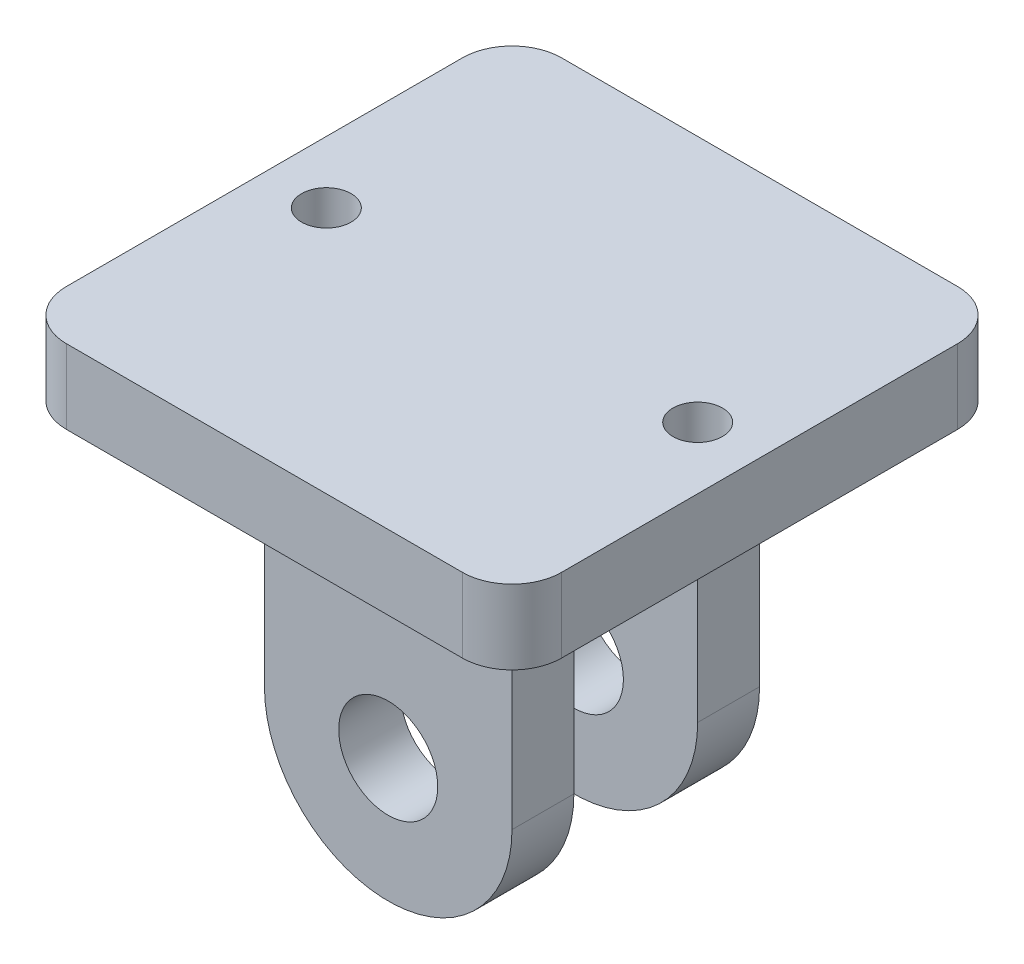
ISO-10303-21;
HEADER;
FILE_DESCRIPTION(('STEP AP214'),'2;1');
FILE_NAME('part.step','',(''),(''),'','','');
FILE_SCHEMA(('AUTOMOTIVE_DESIGN { 1 0 10303 214 1 1 1 1 }'));
ENDSEC;
DATA;
#1=APPLICATION_CONTEXT('core data for automotive mechanical design processes');
#2=APPLICATION_PROTOCOL_DEFINITION('international standard','automotive_design',2000,#1);
#3=PRODUCT_CONTEXT('',#1,'mechanical');
#4=PRODUCT('Part','Part','',(#3));
#5=PRODUCT_RELATED_PRODUCT_CATEGORY('part','',(#4));
#6=PRODUCT_DEFINITION_FORMATION('','',#4);
#7=PRODUCT_DEFINITION_CONTEXT('part definition',#1,'design');
#8=PRODUCT_DEFINITION('design','',#6,#7);
#9=PRODUCT_DEFINITION_SHAPE('','',#8);
#10=(LENGTH_UNIT() NAMED_UNIT(*) SI_UNIT(.MILLI.,.METRE.));
#11=(NAMED_UNIT(*) PLANE_ANGLE_UNIT() SI_UNIT($,.RADIAN.));
#12=(NAMED_UNIT(*) SI_UNIT($,.STERADIAN.) SOLID_ANGLE_UNIT());
#13=UNCERTAINTY_MEASURE_WITH_UNIT(LENGTH_MEASURE(1.E-05),#10,'distance_accuracy_value','');
#14=(GEOMETRIC_REPRESENTATION_CONTEXT(3) GLOBAL_UNCERTAINTY_ASSIGNED_CONTEXT((#13)) GLOBAL_UNIT_ASSIGNED_CONTEXT((#10,
#11,#12)) REPRESENTATION_CONTEXT('',''));
#15=CARTESIAN_POINT('',(0.,0.,0.));
#16=DIRECTION('',(0.,0.,1.));
#17=DIRECTION('',(1.,0.,0.));
#18=AXIS2_PLACEMENT_3D('',#15,#16,#17);
#19=CARTESIAN_POINT('',(0.,-2.49999999999999,0.));
#20=DIRECTION('',(0.,0.,-1.));
#21=DIRECTION('',(-1.,0.,0.));
#22=AXIS2_PLACEMENT_3D('',#19,#20,#21);
#23=CYLINDRICAL_SURFACE('',#22,5.);
#24=CARTESIAN_POINT('',(0.,-2.49999999999999,7.5));
#25=DIRECTION('',(0.,0.,1.));
#26=DIRECTION('',(0.,-1.,0.));
#27=AXIS2_PLACEMENT_3D('',#24,#25,#26);
#28=CIRCLE('',#27,5.);
#29=CARTESIAN_POINT('',(5.,-2.49999999999999,7.5));
#30=VERTEX_POINT('',#29);
#31=CARTESIAN_POINT('',(-5.,-2.49999999999999,7.5));
#32=VERTEX_POINT('',#31);
#33=EDGE_CURVE('E200',#30,#32,#28,.F.);
#34=ORIENTED_EDGE('',*,*,#33,.F.);
#35=DIRECTION('',(0.,0.,-1.));
#36=VECTOR('',#35,1.);
#37=CARTESIAN_POINT('',(5.,-2.49999999999999,10.));
#38=LINE('',#37,#36);
#39=CARTESIAN_POINT('',(5.,-2.49999999999999,10.));
#40=VERTEX_POINT('',#39);
#41=EDGE_CURVE('E227',#40,#30,#38,.T.);
#42=ORIENTED_EDGE('',*,*,#41,.F.);
#43=CARTESIAN_POINT('',(0.,-2.49999999999999,10.));
#44=DIRECTION('',(0.,0.,1.));
#45=DIRECTION('',(1.,0.,0.));
#46=AXIS2_PLACEMENT_3D('',#43,#44,#45);
#47=CIRCLE('',#46,5.);
#48=CARTESIAN_POINT('',(-5.,-2.49999999999999,10.));
#49=VERTEX_POINT('',#48);
#50=EDGE_CURVE('E47',#49,#40,#47,.T.);
#51=ORIENTED_EDGE('',*,*,#50,.F.);
#52=DIRECTION('',(0.,0.,-1.));
#53=VECTOR('',#52,1.);
#54=CARTESIAN_POINT('',(-5.,-2.49999999999999,10.));
#55=LINE('',#54,#53);
#56=EDGE_CURVE('E222',#32,#49,#55,.F.);
#57=ORIENTED_EDGE('',*,*,#56,.F.);
#58=EDGE_LOOP('',(#34,#42,#51,#57));
#59=FACE_BOUND('',#58,.T.);
#60=ADVANCED_FACE('F37',(#59),#23,.T.);
#61=CARTESIAN_POINT('',(0.,-2.49999999999999,2.5));
#62=DIRECTION('',(0.,0.,-1.));
#63=DIRECTION('',(0.,1.,0.));
#64=AXIS2_PLACEMENT_3D('',#61,#62,#63);
#65=CIRCLE('',#64,5.);
#66=CARTESIAN_POINT('',(-5.,-2.5,2.5));
#67=VERTEX_POINT('',#66);
#68=CARTESIAN_POINT('',(5.,-2.5,2.5));
#69=VERTEX_POINT('',#68);
#70=EDGE_CURVE('E197',#67,#69,#65,.F.);
#71=ORIENTED_EDGE('',*,*,#70,.F.);
#72=CARTESIAN_POINT('',(-5.,-2.49999999999999,0.));
#73=VERTEX_POINT('',#72);
#74=EDGE_CURVE('E223',#73,#67,#55,.F.);
#75=ORIENTED_EDGE('',*,*,#74,.F.);
#76=CARTESIAN_POINT('',(0.,-2.49999999999999,0.));
#77=DIRECTION('',(0.,0.,1.));
#78=DIRECTION('',(1.,0.,0.));
#79=AXIS2_PLACEMENT_3D('',#76,#77,#78);
#80=CIRCLE('',#79,5.);
#81=CARTESIAN_POINT('',(5.,-2.49999999999999,0.));
#82=VERTEX_POINT('',#81);
#83=EDGE_CURVE('E230',#82,#73,#80,.F.);
#84=ORIENTED_EDGE('',*,*,#83,.F.);
#85=EDGE_CURVE('E226',#69,#82,#38,.T.);
#86=ORIENTED_EDGE('',*,*,#85,.F.);
#87=EDGE_LOOP('',(#71,#75,#84,#86));
#88=FACE_BOUND('',#87,.T.);
#89=ADVANCED_FACE('F40',(#88),#23,.T.);
#90=CARTESIAN_POINT('',(5.,7.5,10.));
#91=DIRECTION('',(-1.,0.,0.));
#92=DIRECTION('',(0.,-1.,0.));
#93=AXIS2_PLACEMENT_3D('',#90,#91,#92);
#94=PLANE('',#93);
#95=ORIENTED_EDGE('',*,*,#41,.T.);
#96=DIRECTION('',(0.,1.,0.));
#97=VECTOR('',#96,1.);
#98=CARTESIAN_POINT('',(5.,4.5,7.5));
#99=LINE('',#98,#97);
#100=CARTESIAN_POINT('',(5.,4.5,7.5));
#101=VERTEX_POINT('',#100);
#102=EDGE_CURVE('E185',#30,#101,#99,.T.);
#103=ORIENTED_EDGE('',*,*,#102,.T.);
#104=DIRECTION('',(0.,0.,-1.));
#105=VECTOR('',#104,1.);
#106=CARTESIAN_POINT('',(5.,4.5,2.5));
#107=LINE('',#106,#105);
#108=CARTESIAN_POINT('',(5.,4.5,2.5));
#109=VERTEX_POINT('',#108);
#110=EDGE_CURVE('E188',#101,#109,#107,.T.);
#111=ORIENTED_EDGE('',*,*,#110,.T.);
#112=DIRECTION('',(0.,-1.,0.));
#113=VECTOR('',#112,1.);
#114=CARTESIAN_POINT('',(5.,4.5,2.5));
#115=LINE('',#114,#113);
#116=EDGE_CURVE('E191',#109,#69,#115,.T.);
#117=ORIENTED_EDGE('',*,*,#116,.T.);
#118=ORIENTED_EDGE('',*,*,#85,.T.);
#119=DIRECTION('',(0.,1.,0.));
#120=VECTOR('',#119,1.);
#121=CARTESIAN_POINT('',(5.,7.5,0.));
#122=LINE('',#121,#120);
#123=CARTESIAN_POINT('',(5.,7.5,0.));
#124=VERTEX_POINT('',#123);
#125=EDGE_CURVE('E202',#82,#124,#122,.T.);
#126=ORIENTED_EDGE('',*,*,#125,.T.);
#127=DIRECTION('',(0.,0.,-1.));
#128=VECTOR('',#127,1.);
#129=CARTESIAN_POINT('',(5.,7.5,10.));
#130=LINE('',#129,#128);
#131=CARTESIAN_POINT('',(5.,7.5,10.));
#132=VERTEX_POINT('',#131);
#133=EDGE_CURVE('E219',#132,#124,#130,.T.);
#134=ORIENTED_EDGE('',*,*,#133,.F.);
#135=DIRECTION('',(0.,1.,0.));
#136=VECTOR('',#135,1.);
#137=CARTESIAN_POINT('',(5.,7.5,10.));
#138=LINE('',#137,#136);
#139=EDGE_CURVE('E203',#40,#132,#138,.T.);
#140=ORIENTED_EDGE('',*,*,#139,.F.);
#141=EDGE_LOOP('',(#95,#103,#111,#117,#118,#126,#134,#140));
#142=FACE_BOUND('',#141,.T.);
#143=ADVANCED_FACE('F252',(#142),#94,.F.);
#144=CARTESIAN_POINT('',(-5.,7.5,10.));
#145=DIRECTION('',(1.,0.,0.));
#146=DIRECTION('',(0.,1.,0.));
#147=AXIS2_PLACEMENT_3D('',#144,#145,#146);
#148=PLANE('',#147);
#149=DIRECTION('',(0.,0.,-1.));
#150=VECTOR('',#149,1.);
#151=CARTESIAN_POINT('',(-5.,4.5,2.5));
#152=LINE('',#151,#150);
#153=CARTESIAN_POINT('',(-5.,4.5,7.5));
#154=VERTEX_POINT('',#153);
#155=CARTESIAN_POINT('',(-5.,4.5,2.5));
#156=VERTEX_POINT('',#155);
#157=EDGE_CURVE('E177',#154,#156,#152,.T.);
#158=ORIENTED_EDGE('',*,*,#157,.F.);
#159=DIRECTION('',(0.,-1.,0.));
#160=VECTOR('',#159,1.);
#161=CARTESIAN_POINT('',(-5.,7.5,7.5));
#162=LINE('',#161,#160);
#163=EDGE_CURVE('E11',#154,#32,#162,.T.);
#164=ORIENTED_EDGE('',*,*,#163,.T.);
#165=ORIENTED_EDGE('',*,*,#56,.T.);
#166=DIRECTION('',(0.,-1.,0.));
#167=VECTOR('',#166,1.);
#168=CARTESIAN_POINT('',(-5.,7.5,10.));
#169=LINE('',#168,#167);
#170=CARTESIAN_POINT('',(-5.,7.5,10.));
#171=VERTEX_POINT('',#170);
#172=EDGE_CURVE('E208',#171,#49,#169,.T.);
#173=ORIENTED_EDGE('',*,*,#172,.F.);
#174=DIRECTION('',(0.,0.,-1.));
#175=VECTOR('',#174,1.);
#176=CARTESIAN_POINT('',(-5.,7.5,10.));
#177=LINE('',#176,#175);
#178=CARTESIAN_POINT('',(-5.,7.5,0.));
#179=VERTEX_POINT('',#178);
#180=EDGE_CURVE('E210',#171,#179,#177,.T.);
#181=ORIENTED_EDGE('',*,*,#180,.T.);
#182=DIRECTION('',(0.,-1.,0.));
#183=VECTOR('',#182,1.);
#184=CARTESIAN_POINT('',(-5.,7.5,0.));
#185=LINE('',#184,#183);
#186=EDGE_CURVE('E206',#179,#73,#185,.T.);
#187=ORIENTED_EDGE('',*,*,#186,.T.);
#188=ORIENTED_EDGE('',*,*,#74,.T.);
#189=DIRECTION('',(0.,-1.,0.));
#190=VECTOR('',#189,1.);
#191=CARTESIAN_POINT('',(-5.,4.5,2.5));
#192=LINE('',#191,#190);
#193=EDGE_CURVE('E179',#156,#67,#192,.T.);
#194=ORIENTED_EDGE('',*,*,#193,.F.);
#195=EDGE_LOOP('',(#158,#164,#165,#173,#181,#187,#188,#194));
#196=FACE_BOUND('',#195,.T.);
#197=ADVANCED_FACE('F244',(#196),#148,.F.);
#198=CARTESIAN_POINT('',(0.,0.,10.));
#199=DIRECTION('',(0.,0.,1.));
#200=DIRECTION('',(1.,0.,0.));
#201=AXIS2_PLACEMENT_3D('',#198,#199,#200);
#202=PLANE('',#201);
#203=CARTESIAN_POINT('',(0.,-2.49999999999999,10.));
#204=DIRECTION('',(0.,0.,1.));
#205=DIRECTION('',(1.,0.,0.));
#206=AXIS2_PLACEMENT_3D('',#203,#204,#205);
#207=CIRCLE('',#206,2.);
#208=CARTESIAN_POINT('',(2.,-2.49999999999999,10.));
#209=VERTEX_POINT('',#208);
#210=EDGE_CURVE('E471',#209,#209,#207,.T.);
#211=ORIENTED_EDGE('',*,*,#210,.F.);
#212=EDGE_LOOP('',(#211));
#213=FACE_BOUND('',#212,.T.);
#214=ORIENTED_EDGE('',*,*,#172,.T.);
#215=ORIENTED_EDGE('',*,*,#50,.T.);
#216=ORIENTED_EDGE('',*,*,#139,.T.);
#217=DIRECTION('',(-1.,0.,0.));
#218=VECTOR('',#217,1.);
#219=CARTESIAN_POINT('',(-5.,7.5,10.));
#220=LINE('',#219,#218);
#221=EDGE_CURVE('E205',#132,#171,#220,.T.);
#222=ORIENTED_EDGE('',*,*,#221,.T.);
#223=EDGE_LOOP('',(#214,#215,#216,#222));
#224=FACE_BOUND('',#223,.T.);
#225=ADVANCED_FACE('F263',(#213,#224),#202,.T.);
#226=CARTESIAN_POINT('',(0.,0.,0.));
#227=DIRECTION('',(0.,0.,1.));
#228=DIRECTION('',(1.,0.,0.));
#229=AXIS2_PLACEMENT_3D('',#226,#227,#228);
#230=PLANE('',#229);
#231=CARTESIAN_POINT('',(0.,-2.49999999999999,0.));
#232=DIRECTION('',(0.,0.,1.));
#233=DIRECTION('',(1.,0.,0.));
#234=AXIS2_PLACEMENT_3D('',#231,#232,#233);
#235=CIRCLE('',#234,2.);
#236=CARTESIAN_POINT('',(2.,-2.49999999999999,0.));
#237=VERTEX_POINT('',#236);
#238=EDGE_CURVE('E475',#237,#237,#235,.T.);
#239=ORIENTED_EDGE('',*,*,#238,.T.);
#240=EDGE_LOOP('',(#239));
#241=FACE_BOUND('',#240,.T.);
#242=ORIENTED_EDGE('',*,*,#125,.F.);
#243=ORIENTED_EDGE('',*,*,#83,.T.);
#244=ORIENTED_EDGE('',*,*,#186,.F.);
#245=DIRECTION('',(-1.,0.,0.));
#246=VECTOR('',#245,1.);
#247=CARTESIAN_POINT('',(-5.,7.5,0.));
#248=LINE('',#247,#246);
#249=EDGE_CURVE('E213',#124,#179,#248,.T.);
#250=ORIENTED_EDGE('',*,*,#249,.F.);
#251=EDGE_LOOP('',(#242,#243,#244,#250));
#252=FACE_BOUND('',#251,.T.);
#253=ADVANCED_FACE('F237',(#241,#252),#230,.F.);
#254=CARTESIAN_POINT('',(5.,4.5,7.5));
#255=DIRECTION('',(0.,0.,1.));
#256=DIRECTION('',(0.,-1.,0.));
#257=AXIS2_PLACEMENT_3D('',#254,#255,#256);
#258=PLANE('',#257);
#259=CARTESIAN_POINT('',(0.,-2.49999999999999,7.5));
#260=DIRECTION('',(0.,0.,1.));
#261=DIRECTION('',(0.,-1.,0.));
#262=AXIS2_PLACEMENT_3D('',#259,#260,#261);
#263=CIRCLE('',#262,2.);
#264=CARTESIAN_POINT('',(2.,-2.49999999999999,7.50000000000001));
#265=VERTEX_POINT('',#264);
#266=EDGE_CURVE('E474',#265,#265,#263,.T.);
#267=ORIENTED_EDGE('',*,*,#266,.T.);
#268=EDGE_LOOP('',(#267));
#269=FACE_BOUND('',#268,.T.);
#270=ORIENTED_EDGE('',*,*,#33,.T.);
#271=ORIENTED_EDGE('',*,*,#163,.F.);
#272=DIRECTION('',(-1.,0.,0.));
#273=VECTOR('',#272,1.);
#274=CARTESIAN_POINT('',(5.,4.5,7.5));
#275=LINE('',#274,#273);
#276=EDGE_CURVE('E54',#101,#154,#275,.T.);
#277=ORIENTED_EDGE('',*,*,#276,.F.);
#278=ORIENTED_EDGE('',*,*,#102,.F.);
#279=EDGE_LOOP('',(#270,#271,#277,#278));
#280=FACE_BOUND('',#279,.T.);
#281=ADVANCED_FACE('F261',(#269,#280),#258,.F.);
#282=CARTESIAN_POINT('',(5.,4.5,2.5));
#283=DIRECTION('',(0.,0.,-1.));
#284=DIRECTION('',(0.,1.,0.));
#285=AXIS2_PLACEMENT_3D('',#282,#283,#284);
#286=PLANE('',#285);
#287=CARTESIAN_POINT('',(0.,-2.49999999999999,2.5));
#288=DIRECTION('',(0.,0.,-1.));
#289=DIRECTION('',(0.,1.,0.));
#290=AXIS2_PLACEMENT_3D('',#287,#288,#289);
#291=CIRCLE('',#290,2.);
#292=CARTESIAN_POINT('',(2.,-2.49999999999999,2.5));
#293=VERTEX_POINT('',#292);
#294=EDGE_CURVE('E42',#293,#293,#291,.T.);
#295=ORIENTED_EDGE('',*,*,#294,.T.);
#296=EDGE_LOOP('',(#295));
#297=FACE_BOUND('',#296,.T.);
#298=ORIENTED_EDGE('',*,*,#70,.T.);
#299=ORIENTED_EDGE('',*,*,#116,.F.);
#300=DIRECTION('',(-1.,0.,0.));
#301=VECTOR('',#300,1.);
#302=CARTESIAN_POINT('',(5.,4.5,2.5));
#303=LINE('',#302,#301);
#304=EDGE_CURVE('E195',#109,#156,#303,.T.);
#305=ORIENTED_EDGE('',*,*,#304,.T.);
#306=ORIENTED_EDGE('',*,*,#193,.T.);
#307=EDGE_LOOP('',(#298,#299,#305,#306));
#308=FACE_BOUND('',#307,.T.);
#309=ADVANCED_FACE('F256',(#297,#308),#286,.F.);
#310=CARTESIAN_POINT('',(5.,4.5,2.5));
#311=DIRECTION('',(0.,1.,0.));
#312=DIRECTION('',(-1.,0.,0.));
#313=AXIS2_PLACEMENT_3D('',#310,#311,#312);
#314=PLANE('',#313);
#315=ORIENTED_EDGE('',*,*,#157,.T.);
#316=ORIENTED_EDGE('',*,*,#304,.F.);
#317=ORIENTED_EDGE('',*,*,#110,.F.);
#318=ORIENTED_EDGE('',*,*,#276,.T.);
#319=EDGE_LOOP('',(#315,#316,#317,#318));
#320=FACE_BOUND('',#319,.T.);
#321=ADVANCED_FACE('F258',(#320),#314,.F.);
#322=CARTESIAN_POINT('',(0.,7.5,0.));
#323=DIRECTION('',(0.,1.,0.));
#324=DIRECTION('',(0.,0.,1.));
#325=AXIS2_PLACEMENT_3D('',#322,#323,#324);
#326=PLANE('',#325);
#327=CARTESIAN_POINT('',(-7.5,7.5,5.));
#328=DIRECTION('',(0.,-1.,0.));
#329=DIRECTION('',(0.,0.,-1.));
#330=AXIS2_PLACEMENT_3D('',#327,#328,#329);
#331=CIRCLE('',#330,1.);
#332=CARTESIAN_POINT('',(-7.5,7.5,4.));
#333=VERTEX_POINT('',#332);
#334=EDGE_CURVE('E486',#333,#333,#331,.T.);
#335=ORIENTED_EDGE('',*,*,#334,.F.);
#336=EDGE_LOOP('',(#335));
#337=FACE_BOUND('',#336,.T.);
#338=CARTESIAN_POINT('',(7.5,7.5,5.));
#339=DIRECTION('',(0.,-1.,0.));
#340=DIRECTION('',(0.,0.,-1.));
#341=AXIS2_PLACEMENT_3D('',#338,#339,#340);
#342=CIRCLE('',#341,1.);
#343=CARTESIAN_POINT('',(7.5,7.5,4.));
#344=VERTEX_POINT('',#343);
#345=EDGE_CURVE('E478',#344,#344,#342,.T.);
#346=ORIENTED_EDGE('',*,*,#345,.F.);
#347=EDGE_LOOP('',(#346));
#348=FACE_BOUND('',#347,.T.);
#349=DIRECTION('',(-1.,0.,0.));
#350=VECTOR('',#349,1.);
#351=CARTESIAN_POINT('',(0.,7.5,-5.));
#352=LINE('',#351,#350);
#353=CARTESIAN_POINT('',(7.99999999999998,7.5,-5.));
#354=VERTEX_POINT('',#353);
#355=CARTESIAN_POINT('',(-7.99999999999999,7.5,-5.));
#356=VERTEX_POINT('',#355);
#357=EDGE_CURVE('E176',#354,#356,#352,.T.);
#358=ORIENTED_EDGE('',*,*,#357,.F.);
#359=CARTESIAN_POINT('',(8.,7.5,-3.));
#360=DIRECTION('',(0.,1.,0.));
#361=DIRECTION('',(0.,0.,1.));
#362=AXIS2_PLACEMENT_3D('',#359,#360,#361);
#363=CIRCLE('',#362,2.);
#364=CARTESIAN_POINT('',(10.,7.5,-2.99999999999999));
#365=VERTEX_POINT('',#364);
#366=EDGE_CURVE('E172',#354,#365,#363,.F.);
#367=ORIENTED_EDGE('',*,*,#366,.T.);
#368=DIRECTION('',(0.,0.,-1.));
#369=VECTOR('',#368,1.);
#370=CARTESIAN_POINT('',(10.,7.5,0.));
#371=LINE('',#370,#369);
#372=CARTESIAN_POINT('',(10.,7.5,13.));
#373=VERTEX_POINT('',#372);
#374=EDGE_CURVE('E516',#373,#365,#371,.T.);
#375=ORIENTED_EDGE('',*,*,#374,.F.);
#376=CARTESIAN_POINT('',(8.,7.5,13.));
#377=DIRECTION('',(0.,1.,0.));
#378=DIRECTION('',(0.,0.,1.));
#379=AXIS2_PLACEMENT_3D('',#376,#377,#378);
#380=CIRCLE('',#379,2.);
#381=CARTESIAN_POINT('',(7.99999999999998,7.5,15.));
#382=VERTEX_POINT('',#381);
#383=EDGE_CURVE('E514',#382,#373,#380,.T.);
#384=ORIENTED_EDGE('',*,*,#383,.F.);
#385=DIRECTION('',(1.,0.,0.));
#386=VECTOR('',#385,1.);
#387=CARTESIAN_POINT('',(0.,7.5,15.));
#388=LINE('',#387,#386);
#389=CARTESIAN_POINT('',(-7.99999999999999,7.5,15.));
#390=VERTEX_POINT('',#389);
#391=EDGE_CURVE('E512',#390,#382,#388,.T.);
#392=ORIENTED_EDGE('',*,*,#391,.F.);
#393=CARTESIAN_POINT('',(-8.,7.5,13.));
#394=DIRECTION('',(0.,1.,0.));
#395=DIRECTION('',(0.,0.,1.));
#396=AXIS2_PLACEMENT_3D('',#393,#394,#395);
#397=CIRCLE('',#396,2.);
#398=CARTESIAN_POINT('',(-10.,7.5,13.));
#399=VERTEX_POINT('',#398);
#400=EDGE_CURVE('E510',#399,#390,#397,.T.);
#401=ORIENTED_EDGE('',*,*,#400,.F.);
#402=DIRECTION('',(0.,0.,1.));
#403=VECTOR('',#402,1.);
#404=CARTESIAN_POINT('',(-10.,7.5,0.));
#405=LINE('',#404,#403);
#406=CARTESIAN_POINT('',(-10.,7.5,-2.99999999999998));
#407=VERTEX_POINT('',#406);
#408=EDGE_CURVE('E508',#407,#399,#405,.T.);
#409=ORIENTED_EDGE('',*,*,#408,.F.);
#410=CARTESIAN_POINT('',(-8.,7.5,-3.));
#411=DIRECTION('',(0.,1.,0.));
#412=DIRECTION('',(0.,0.,1.));
#413=AXIS2_PLACEMENT_3D('',#410,#411,#412);
#414=CIRCLE('',#413,2.);
#415=EDGE_CURVE('E506',#356,#407,#414,.T.);
#416=ORIENTED_EDGE('',*,*,#415,.F.);
#417=EDGE_LOOP('',(#358,#367,#375,#384,#392,#401,#409,#416));
#418=FACE_BOUND('',#417,.T.);
#419=ORIENTED_EDGE('',*,*,#133,.T.);
#420=ORIENTED_EDGE('',*,*,#249,.T.);
#421=ORIENTED_EDGE('',*,*,#180,.F.);
#422=ORIENTED_EDGE('',*,*,#221,.F.);
#423=EDGE_LOOP('',(#419,#420,#421,#422));
#424=FACE_BOUND('',#423,.T.);
#425=ADVANCED_FACE('F249',(#337,#348,#418,#424),#326,.F.);
#426=CARTESIAN_POINT('',(0.,10.5,-5.));
#427=DIRECTION('',(0.,0.,1.));
#428=DIRECTION('',(1.,0.,0.));
#429=AXIS2_PLACEMENT_3D('',#426,#427,#428);
#430=PLANE('',#429);
#431=ORIENTED_EDGE('',*,*,#357,.T.);
#432=DIRECTION('',(0.,-1.,0.));
#433=VECTOR('',#432,1.);
#434=CARTESIAN_POINT('',(-7.99999999999999,10.5,-5.));
#435=LINE('',#434,#433);
#436=CARTESIAN_POINT('',(-7.99999999999999,10.5,-5.));
#437=VERTEX_POINT('',#436);
#438=EDGE_CURVE('E157',#437,#356,#435,.T.);
#439=ORIENTED_EDGE('',*,*,#438,.F.);
#440=DIRECTION('',(-1.,0.,0.));
#441=VECTOR('',#440,1.);
#442=CARTESIAN_POINT('',(0.,10.5,-5.));
#443=LINE('',#442,#441);
#444=CARTESIAN_POINT('',(7.99999999999998,10.5,-5.));
#445=VERTEX_POINT('',#444);
#446=EDGE_CURVE('E164',#445,#437,#443,.T.);
#447=ORIENTED_EDGE('',*,*,#446,.F.);
#448=DIRECTION('',(0.,-1.,0.));
#449=VECTOR('',#448,1.);
#450=CARTESIAN_POINT('',(7.99999999999998,10.5,-5.));
#451=LINE('',#450,#449);
#452=EDGE_CURVE('E504',#445,#354,#451,.T.);
#453=ORIENTED_EDGE('',*,*,#452,.T.);
#454=EDGE_LOOP('',(#431,#439,#447,#453));
#455=FACE_BOUND('',#454,.T.);
#456=ADVANCED_FACE('F174',(#455),#430,.F.);
#457=CARTESIAN_POINT('',(-8.,10.5,-3.));
#458=DIRECTION('',(0.,-1.,0.));
#459=DIRECTION('',(0.,0.,-1.));
#460=AXIS2_PLACEMENT_3D('',#457,#458,#459);
#461=CYLINDRICAL_SURFACE('',#460,2.);
#462=ORIENTED_EDGE('',*,*,#415,.T.);
#463=DIRECTION('',(0.,-1.,0.));
#464=VECTOR('',#463,1.);
#465=CARTESIAN_POINT('',(-10.,10.5,-2.99999999999998));
#466=LINE('',#465,#464);
#467=CARTESIAN_POINT('',(-10.,10.5,-2.99999999999998));
#468=VERTEX_POINT('',#467);
#469=EDGE_CURVE('E160',#468,#407,#466,.T.);
#470=ORIENTED_EDGE('',*,*,#469,.F.);
#471=CARTESIAN_POINT('',(-8.,10.5,-3.));
#472=DIRECTION('',(0.,1.,0.));
#473=DIRECTION('',(0.,0.,1.));
#474=AXIS2_PLACEMENT_3D('',#471,#472,#473);
#475=CIRCLE('',#474,2.);
#476=EDGE_CURVE('E153',#437,#468,#475,.T.);
#477=ORIENTED_EDGE('',*,*,#476,.F.);
#478=ORIENTED_EDGE('',*,*,#438,.T.);
#479=EDGE_LOOP('',(#462,#470,#477,#478));
#480=FACE_BOUND('',#479,.T.);
#481=ADVANCED_FACE('F155',(#480),#461,.T.);
#482=CARTESIAN_POINT('',(-10.,10.5,0.));
#483=DIRECTION('',(1.,0.,0.));
#484=DIRECTION('',(0.,0.,-1.));
#485=AXIS2_PLACEMENT_3D('',#482,#483,#484);
#486=PLANE('',#485);
#487=ORIENTED_EDGE('',*,*,#408,.T.);
#488=DIRECTION('',(0.,-1.,0.));
#489=VECTOR('',#488,1.);
#490=CARTESIAN_POINT('',(-10.,10.5,13.));
#491=LINE('',#490,#489);
#492=CARTESIAN_POINT('',(-10.,10.5,13.));
#493=VERTEX_POINT('',#492);
#494=EDGE_CURVE('E181',#493,#399,#491,.T.);
#495=ORIENTED_EDGE('',*,*,#494,.F.);
#496=DIRECTION('',(0.,0.,1.));
#497=VECTOR('',#496,1.);
#498=CARTESIAN_POINT('',(-10.,10.5,0.));
#499=LINE('',#498,#497);
#500=EDGE_CURVE('E163',#468,#493,#499,.T.);
#501=ORIENTED_EDGE('',*,*,#500,.F.);
#502=ORIENTED_EDGE('',*,*,#469,.T.);
#503=EDGE_LOOP('',(#487,#495,#501,#502));
#504=FACE_BOUND('',#503,.T.);
#505=ADVANCED_FACE('F310',(#504),#486,.F.);
#506=CARTESIAN_POINT('',(-8.,10.5,13.));
#507=DIRECTION('',(0.,-1.,0.));
#508=DIRECTION('',(0.,0.,-1.));
#509=AXIS2_PLACEMENT_3D('',#506,#507,#508);
#510=CYLINDRICAL_SURFACE('',#509,2.);
#511=ORIENTED_EDGE('',*,*,#400,.T.);
#512=DIRECTION('',(0.,-1.,0.));
#513=VECTOR('',#512,1.);
#514=CARTESIAN_POINT('',(-7.99999999999999,10.5,15.));
#515=LINE('',#514,#513);
#516=CARTESIAN_POINT('',(-7.99999999999999,10.5,15.));
#517=VERTEX_POINT('',#516);
#518=EDGE_CURVE('E530',#517,#390,#515,.T.);
#519=ORIENTED_EDGE('',*,*,#518,.F.);
#520=CARTESIAN_POINT('',(-8.,10.5,13.));
#521=DIRECTION('',(0.,1.,0.));
#522=DIRECTION('',(0.,0.,1.));
#523=AXIS2_PLACEMENT_3D('',#520,#521,#522);
#524=CIRCLE('',#523,2.);
#525=EDGE_CURVE('E495',#493,#517,#524,.T.);
#526=ORIENTED_EDGE('',*,*,#525,.F.);
#527=ORIENTED_EDGE('',*,*,#494,.T.);
#528=EDGE_LOOP('',(#511,#519,#526,#527));
#529=FACE_BOUND('',#528,.T.);
#530=ADVANCED_FACE('F319',(#529),#510,.T.);
#531=CARTESIAN_POINT('',(0.,10.5,15.));
#532=DIRECTION('',(0.,0.,-1.));
#533=DIRECTION('',(-1.,0.,0.));
#534=AXIS2_PLACEMENT_3D('',#531,#532,#533);
#535=PLANE('',#534);
#536=ORIENTED_EDGE('',*,*,#391,.T.);
#537=DIRECTION('',(0.,-1.,0.));
#538=VECTOR('',#537,1.);
#539=CARTESIAN_POINT('',(7.99999999999998,10.5,15.));
#540=LINE('',#539,#538);
#541=CARTESIAN_POINT('',(7.99999999999998,10.5,15.));
#542=VERTEX_POINT('',#541);
#543=EDGE_CURVE('E527',#542,#382,#540,.T.);
#544=ORIENTED_EDGE('',*,*,#543,.F.);
#545=DIRECTION('',(1.,0.,0.));
#546=VECTOR('',#545,1.);
#547=CARTESIAN_POINT('',(0.,10.5,15.));
#548=LINE('',#547,#546);
#549=EDGE_CURVE('E497',#517,#542,#548,.T.);
#550=ORIENTED_EDGE('',*,*,#549,.F.);
#551=ORIENTED_EDGE('',*,*,#518,.T.);
#552=EDGE_LOOP('',(#536,#544,#550,#551));
#553=FACE_BOUND('',#552,.T.);
#554=ADVANCED_FACE('F329',(#553),#535,.F.);
#555=CARTESIAN_POINT('',(8.,10.5,13.));
#556=DIRECTION('',(0.,-1.,0.));
#557=DIRECTION('',(0.,0.,-1.));
#558=AXIS2_PLACEMENT_3D('',#555,#556,#557);
#559=CYLINDRICAL_SURFACE('',#558,2.);
#560=ORIENTED_EDGE('',*,*,#383,.T.);
#561=DIRECTION('',(0.,-1.,0.));
#562=VECTOR('',#561,1.);
#563=CARTESIAN_POINT('',(10.,10.5,13.));
#564=LINE('',#563,#562);
#565=CARTESIAN_POINT('',(10.,10.5,13.));
#566=VERTEX_POINT('',#565);
#567=EDGE_CURVE('E524',#566,#373,#564,.T.);
#568=ORIENTED_EDGE('',*,*,#567,.F.);
#569=CARTESIAN_POINT('',(8.,10.5,13.));
#570=DIRECTION('',(0.,1.,0.));
#571=DIRECTION('',(0.,0.,1.));
#572=AXIS2_PLACEMENT_3D('',#569,#570,#571);
#573=CIRCLE('',#572,2.);
#574=EDGE_CURVE('E499',#542,#566,#573,.T.);
#575=ORIENTED_EDGE('',*,*,#574,.F.);
#576=ORIENTED_EDGE('',*,*,#543,.T.);
#577=EDGE_LOOP('',(#560,#568,#575,#576));
#578=FACE_BOUND('',#577,.T.);
#579=ADVANCED_FACE('F339',(#578),#559,.T.);
#580=CARTESIAN_POINT('',(10.,10.5,0.));
#581=DIRECTION('',(-1.,0.,0.));
#582=DIRECTION('',(0.,0.,1.));
#583=AXIS2_PLACEMENT_3D('',#580,#581,#582);
#584=PLANE('',#583);
#585=ORIENTED_EDGE('',*,*,#374,.T.);
#586=DIRECTION('',(0.,-1.,0.));
#587=VECTOR('',#586,1.);
#588=CARTESIAN_POINT('',(10.,10.5,-2.99999999999999));
#589=LINE('',#588,#587);
#590=CARTESIAN_POINT('',(10.,10.5,-2.99999999999999));
#591=VERTEX_POINT('',#590);
#592=EDGE_CURVE('E522',#591,#365,#589,.T.);
#593=ORIENTED_EDGE('',*,*,#592,.F.);
#594=DIRECTION('',(0.,0.,-1.));
#595=VECTOR('',#594,1.);
#596=CARTESIAN_POINT('',(10.,10.5,0.));
#597=LINE('',#596,#595);
#598=EDGE_CURVE('E501',#566,#591,#597,.T.);
#599=ORIENTED_EDGE('',*,*,#598,.F.);
#600=ORIENTED_EDGE('',*,*,#567,.T.);
#601=EDGE_LOOP('',(#585,#593,#599,#600));
#602=FACE_BOUND('',#601,.T.);
#603=ADVANCED_FACE('F349',(#602),#584,.F.);
#604=CARTESIAN_POINT('',(8.,10.5,-3.));
#605=DIRECTION('',(0.,-1.,0.));
#606=DIRECTION('',(0.,0.,-1.));
#607=AXIS2_PLACEMENT_3D('',#604,#605,#606);
#608=CYLINDRICAL_SURFACE('',#607,2.);
#609=ORIENTED_EDGE('',*,*,#366,.F.);
#610=ORIENTED_EDGE('',*,*,#452,.F.);
#611=CARTESIAN_POINT('',(8.,10.5,-3.));
#612=DIRECTION('',(0.,1.,0.));
#613=DIRECTION('',(0.,0.,1.));
#614=AXIS2_PLACEMENT_3D('',#611,#612,#613);
#615=CIRCLE('',#614,2.);
#616=EDGE_CURVE('E170',#445,#591,#615,.F.);
#617=ORIENTED_EDGE('',*,*,#616,.T.);
#618=ORIENTED_EDGE('',*,*,#592,.T.);
#619=EDGE_LOOP('',(#609,#610,#617,#618));
#620=FACE_BOUND('',#619,.T.);
#621=ADVANCED_FACE('F359',(#620),#608,.T.);
#622=CARTESIAN_POINT('',(0.,10.5,0.));
#623=DIRECTION('',(0.,1.,0.));
#624=DIRECTION('',(0.,0.,1.));
#625=AXIS2_PLACEMENT_3D('',#622,#623,#624);
#626=PLANE('',#625);
#627=CARTESIAN_POINT('',(-7.5,10.5,5.));
#628=DIRECTION('',(0.,-1.,0.));
#629=DIRECTION('',(0.,0.,-1.));
#630=AXIS2_PLACEMENT_3D('',#627,#628,#629);
#631=CIRCLE('',#630,1.);
#632=CARTESIAN_POINT('',(-7.5,10.5,4.));
#633=VERTEX_POINT('',#632);
#634=EDGE_CURVE('E483',#633,#633,#631,.T.);
#635=ORIENTED_EDGE('',*,*,#634,.T.);
#636=EDGE_LOOP('',(#635));
#637=FACE_BOUND('',#636,.T.);
#638=CARTESIAN_POINT('',(7.5,10.5,5.));
#639=DIRECTION('',(0.,-1.,0.));
#640=DIRECTION('',(0.,0.,-1.));
#641=AXIS2_PLACEMENT_3D('',#638,#639,#640);
#642=CIRCLE('',#641,1.);
#643=CARTESIAN_POINT('',(7.5,10.5,4.));
#644=VERTEX_POINT('',#643);
#645=EDGE_CURVE('E489',#644,#644,#642,.T.);
#646=ORIENTED_EDGE('',*,*,#645,.T.);
#647=EDGE_LOOP('',(#646));
#648=FACE_BOUND('',#647,.T.);
#649=ORIENTED_EDGE('',*,*,#446,.T.);
#650=ORIENTED_EDGE('',*,*,#476,.T.);
#651=ORIENTED_EDGE('',*,*,#500,.T.);
#652=ORIENTED_EDGE('',*,*,#525,.T.);
#653=ORIENTED_EDGE('',*,*,#549,.T.);
#654=ORIENTED_EDGE('',*,*,#574,.T.);
#655=ORIENTED_EDGE('',*,*,#598,.T.);
#656=ORIENTED_EDGE('',*,*,#616,.F.);
#657=EDGE_LOOP('',(#649,#650,#651,#652,#653,#654,#655,#656));
#658=FACE_BOUND('',#657,.T.);
#659=ADVANCED_FACE('F168',(#637,#648,#658),#626,.T.);
#660=CARTESIAN_POINT('',(7.5,10.5,5.));
#661=DIRECTION('',(0.,-1.,0.));
#662=DIRECTION('',(0.,0.,-1.));
#663=AXIS2_PLACEMENT_3D('',#660,#661,#662);
#664=CYLINDRICAL_SURFACE('',#663,1.);
#665=ORIENTED_EDGE('',*,*,#645,.F.);
#666=EDGE_LOOP('',(#665));
#667=FACE_BOUND('',#666,.T.);
#668=ORIENTED_EDGE('',*,*,#345,.T.);
#669=EDGE_LOOP('',(#668));
#670=FACE_BOUND('',#669,.T.);
#671=ADVANCED_FACE('F387',(#667,#670),#664,.F.);
#672=CARTESIAN_POINT('',(-7.5,10.5,5.));
#673=DIRECTION('',(0.,-1.,0.));
#674=DIRECTION('',(0.,0.,-1.));
#675=AXIS2_PLACEMENT_3D('',#672,#673,#674);
#676=CYLINDRICAL_SURFACE('',#675,1.);
#677=ORIENTED_EDGE('',*,*,#634,.F.);
#678=EDGE_LOOP('',(#677));
#679=FACE_BOUND('',#678,.T.);
#680=ORIENTED_EDGE('',*,*,#334,.T.);
#681=EDGE_LOOP('',(#680));
#682=FACE_BOUND('',#681,.T.);
#683=ADVANCED_FACE('F397',(#679,#682),#676,.F.);
#684=CARTESIAN_POINT('',(0.,-2.49999999999999,-5.));
#685=DIRECTION('',(0.,0.,1.));
#686=DIRECTION('',(1.,0.,0.));
#687=AXIS2_PLACEMENT_3D('',#684,#685,#686);
#688=CYLINDRICAL_SURFACE('',#687,2.);
#689=CARTESIAN_POINT('',(2.,-2.49999999999999,2.5));
#690=CARTESIAN_POINT('',(2.,-2.49999999999999,2.47395833333333));
#691=CARTESIAN_POINT('',(2.,-2.49999999999999,2.44791666666667));
#692=CARTESIAN_POINT('',(2.,-2.49999999999999,2.39583333333333));
#693=CARTESIAN_POINT('',(2.,-2.49999999999999,2.36979166666667));
#694=CARTESIAN_POINT('',(2.,-2.49999999999999,2.31770833333333));
#695=CARTESIAN_POINT('',(2.,-2.49999999999999,2.29166666666667));
#696=CARTESIAN_POINT('',(2.,-2.49999999999999,2.23958333333333));
#697=CARTESIAN_POINT('',(2.,-2.49999999999999,2.21354166666667));
#698=CARTESIAN_POINT('',(2.,-2.49999999999999,2.16145833333333));
#699=CARTESIAN_POINT('',(2.,-2.49999999999999,2.13541666666667));
#700=CARTESIAN_POINT('',(2.,-2.49999999999999,2.08333333333333));
#701=CARTESIAN_POINT('',(2.,-2.49999999999999,2.05729166666667));
#702=CARTESIAN_POINT('',(2.,-2.49999999999999,2.00520833333333));
#703=CARTESIAN_POINT('',(2.,-2.49999999999999,1.97916666666667));
#704=CARTESIAN_POINT('',(2.,-2.49999999999999,1.92708333333333));
#705=CARTESIAN_POINT('',(2.,-2.49999999999999,1.90104166666667));
#706=CARTESIAN_POINT('',(2.,-2.49999999999999,1.84895833333333));
#707=CARTESIAN_POINT('',(2.,-2.49999999999999,1.82291666666667));
#708=CARTESIAN_POINT('',(2.,-2.49999999999999,1.77083333333333));
#709=CARTESIAN_POINT('',(2.,-2.49999999999999,1.74479166666667));
#710=CARTESIAN_POINT('',(2.,-2.49999999999999,1.69270833333333));
#711=CARTESIAN_POINT('',(2.,-2.49999999999999,1.66666666666667));
#712=CARTESIAN_POINT('',(2.,-2.49999999999999,1.61458333333333));
#713=CARTESIAN_POINT('',(2.,-2.49999999999999,1.58854166666667));
#714=CARTESIAN_POINT('',(2.,-2.49999999999999,1.53645833333333));
#715=CARTESIAN_POINT('',(2.,-2.49999999999999,1.51041666666667));
#716=CARTESIAN_POINT('',(2.,-2.49999999999999,1.45833333333333));
#717=CARTESIAN_POINT('',(2.,-2.49999999999999,1.43229166666667));
#718=CARTESIAN_POINT('',(2.,-2.49999999999999,1.38020833333333));
#719=CARTESIAN_POINT('',(2.,-2.49999999999999,1.35416666666667));
#720=CARTESIAN_POINT('',(2.,-2.49999999999999,1.30208333333333));
#721=CARTESIAN_POINT('',(2.,-2.49999999999999,1.27604166666667));
#722=CARTESIAN_POINT('',(2.,-2.49999999999999,1.22395833333333));
#723=CARTESIAN_POINT('',(2.,-2.49999999999999,1.19791666666667));
#724=CARTESIAN_POINT('',(2.,-2.49999999999999,1.14583333333333));
#725=CARTESIAN_POINT('',(2.,-2.49999999999999,1.11979166666667));
#726=CARTESIAN_POINT('',(2.,-2.49999999999999,1.06770833333333));
#727=CARTESIAN_POINT('',(2.,-2.49999999999999,1.04166666666667));
#728=CARTESIAN_POINT('',(2.,-2.49999999999999,0.989583333333333));
#729=CARTESIAN_POINT('',(2.,-2.49999999999999,0.963541666666667));
#730=CARTESIAN_POINT('',(2.,-2.49999999999999,0.911458333333333));
#731=CARTESIAN_POINT('',(2.,-2.49999999999999,0.885416666666667));
#732=CARTESIAN_POINT('',(2.,-2.49999999999999,0.833333333333333));
#733=CARTESIAN_POINT('',(2.,-2.49999999999999,0.807291666666667));
#734=CARTESIAN_POINT('',(2.,-2.49999999999999,0.755208333333333));
#735=CARTESIAN_POINT('',(2.,-2.49999999999999,0.729166666666667));
#736=CARTESIAN_POINT('',(2.,-2.49999999999999,0.677083333333333));
#737=CARTESIAN_POINT('',(2.,-2.49999999999999,0.651041666666666));
#738=CARTESIAN_POINT('',(2.,-2.49999999999999,0.598958333333333));
#739=CARTESIAN_POINT('',(2.,-2.49999999999999,0.572916666666666));
#740=CARTESIAN_POINT('',(2.,-2.49999999999999,0.520833333333333));
#741=CARTESIAN_POINT('',(2.,-2.49999999999999,0.494791666666666));
#742=CARTESIAN_POINT('',(2.,-2.49999999999999,0.442708333333333));
#743=CARTESIAN_POINT('',(2.,-2.49999999999999,0.416666666666666));
#744=CARTESIAN_POINT('',(2.,-2.49999999999999,0.364583333333333));
#745=CARTESIAN_POINT('',(2.,-2.49999999999999,0.338541666666666));
#746=CARTESIAN_POINT('',(2.,-2.49999999999999,0.286458333333333));
#747=CARTESIAN_POINT('',(2.,-2.49999999999999,0.260416666666666));
#748=CARTESIAN_POINT('',(2.,-2.49999999999999,0.208333333333333));
#749=CARTESIAN_POINT('',(2.,-2.49999999999999,0.182291666666666));
#750=CARTESIAN_POINT('',(2.,-2.49999999999999,0.130208333333333));
#751=CARTESIAN_POINT('',(2.,-2.49999999999999,0.104166666666666));
#752=CARTESIAN_POINT('',(2.,-2.49999999999999,0.0520833333333325));
#753=CARTESIAN_POINT('',(2.,-2.49999999999999,0.0260416666666658));
#754=CARTESIAN_POINT('',(2.,-2.49999999999999,0.));
#755=B_SPLINE_CURVE_WITH_KNOTS('',3,(#689,#690,#691,#692,#693,#694,#695,#696,#697,#698,#699,
#700,#701,#702,#703,#704,#705,#706,#707,#708,#709,#710,#711,#712,#713,#714,#715,#716,#717,#718,
#719,#720,#721,#722,#723,#724,#725,#726,#727,#728,#729,#730,#731,#732,#733,#734,#735,#736,#737,
#738,#739,#740,#741,#742,#743,#744,#745,#746,#747,#748,#749,#750,#751,#752,#753,#754),
.UNSPECIFIED.,.F.,.F.,(4,2,2,2,2,2,2,2,2,2,2,2,2,2,2,2,2,2,2,2,2,2,2,2,2,2,2,2,2,2,2,2,4),(0.,
0.0781250000000001,0.15625,0.234375,0.3125,0.390625,0.46875,0.546875,0.625000000000001,
0.703125000000001,0.781250000000001,0.859375000000001,0.937500000000001,1.015625,1.09375,
1.171875,1.25,1.328125,1.40625,1.484375,1.5625,1.640625,1.71875,1.796875,1.875,1.953125,2.03125,
2.109375,2.1875,2.265625,2.34375,2.421875,2.5),.UNSPECIFIED.);
#756=EDGE_CURVE('BSEAM406',#293,#237,#755,.T.);
#757=ORIENTED_EDGE('',*,*,#294,.F.);
#758=ORIENTED_EDGE('',*,*,#238,.F.);
#759=ORIENTED_EDGE('',*,*,#756,.T.);
#760=ORIENTED_EDGE('',*,*,#756,.F.);
#761=EDGE_LOOP('',(#757,#759,#758,#760));
#762=FACE_BOUND('',#761,.T.);
#763=ADVANCED_FACE('F406',(#762),#688,.F.);
#764=CARTESIAN_POINT('',(2.,-2.49999999999999,10.));
#765=CARTESIAN_POINT('',(2.,-2.49999999999999,9.97395833333333));
#766=CARTESIAN_POINT('',(2.,-2.49999999999999,9.94791666666667));
#767=CARTESIAN_POINT('',(2.,-2.49999999999999,9.89583333333333));
#768=CARTESIAN_POINT('',(2.,-2.49999999999999,9.86979166666667));
#769=CARTESIAN_POINT('',(2.,-2.49999999999999,9.81770833333333));
#770=CARTESIAN_POINT('',(2.,-2.49999999999999,9.79166666666667));
#771=CARTESIAN_POINT('',(2.,-2.49999999999999,9.73958333333333));
#772=CARTESIAN_POINT('',(2.,-2.49999999999999,9.71354166666667));
#773=CARTESIAN_POINT('',(2.,-2.49999999999999,9.66145833333333));
#774=CARTESIAN_POINT('',(2.,-2.49999999999999,9.63541666666667));
#775=CARTESIAN_POINT('',(2.,-2.49999999999999,9.58333333333333));
#776=CARTESIAN_POINT('',(2.,-2.49999999999999,9.55729166666667));
#777=CARTESIAN_POINT('',(2.,-2.49999999999999,9.50520833333333));
#778=CARTESIAN_POINT('',(2.,-2.49999999999999,9.47916666666667));
#779=CARTESIAN_POINT('',(2.,-2.49999999999999,9.42708333333333));
#780=CARTESIAN_POINT('',(2.,-2.49999999999999,9.40104166666667));
#781=CARTESIAN_POINT('',(2.,-2.49999999999999,9.34895833333333));
#782=CARTESIAN_POINT('',(2.,-2.49999999999999,9.32291666666667));
#783=CARTESIAN_POINT('',(2.,-2.49999999999999,9.27083333333333));
#784=CARTESIAN_POINT('',(2.,-2.49999999999999,9.24479166666667));
#785=CARTESIAN_POINT('',(2.,-2.49999999999999,9.19270833333333));
#786=CARTESIAN_POINT('',(2.,-2.49999999999999,9.16666666666667));
#787=CARTESIAN_POINT('',(2.,-2.49999999999999,9.11458333333334));
#788=CARTESIAN_POINT('',(2.,-2.49999999999999,9.08854166666667));
#789=CARTESIAN_POINT('',(2.,-2.49999999999999,9.03645833333334));
#790=CARTESIAN_POINT('',(2.,-2.49999999999999,9.01041666666667));
#791=CARTESIAN_POINT('',(2.,-2.49999999999999,8.95833333333334));
#792=CARTESIAN_POINT('',(2.,-2.49999999999999,8.93229166666667));
#793=CARTESIAN_POINT('',(2.,-2.49999999999999,8.88020833333334));
#794=CARTESIAN_POINT('',(2.,-2.49999999999999,8.85416666666667));
#795=CARTESIAN_POINT('',(2.,-2.49999999999999,8.80208333333334));
#796=CARTESIAN_POINT('',(2.,-2.49999999999999,8.77604166666667));
#797=CARTESIAN_POINT('',(2.,-2.49999999999999,8.72395833333334));
#798=CARTESIAN_POINT('',(2.,-2.49999999999999,8.69791666666667));
#799=CARTESIAN_POINT('',(2.,-2.49999999999999,8.64583333333334));
#800=CARTESIAN_POINT('',(2.,-2.49999999999999,8.61979166666667));
#801=CARTESIAN_POINT('',(2.,-2.49999999999999,8.56770833333334));
#802=CARTESIAN_POINT('',(2.,-2.49999999999999,8.54166666666667));
#803=CARTESIAN_POINT('',(2.,-2.49999999999999,8.48958333333334));
#804=CARTESIAN_POINT('',(2.,-2.49999999999999,8.46354166666667));
#805=CARTESIAN_POINT('',(2.,-2.49999999999999,8.41145833333334));
#806=CARTESIAN_POINT('',(2.,-2.49999999999999,8.38541666666667));
#807=CARTESIAN_POINT('',(2.,-2.49999999999999,8.33333333333334));
#808=CARTESIAN_POINT('',(2.,-2.49999999999999,8.30729166666667));
#809=CARTESIAN_POINT('',(2.,-2.49999999999999,8.25520833333334));
#810=CARTESIAN_POINT('',(2.,-2.49999999999999,8.22916666666667));
#811=CARTESIAN_POINT('',(2.,-2.49999999999999,8.17708333333334));
#812=CARTESIAN_POINT('',(2.,-2.49999999999999,8.15104166666667));
#813=CARTESIAN_POINT('',(2.,-2.49999999999999,8.09895833333334));
#814=CARTESIAN_POINT('',(2.,-2.49999999999999,8.07291666666667));
#815=CARTESIAN_POINT('',(2.,-2.49999999999999,8.02083333333334));
#816=CARTESIAN_POINT('',(2.,-2.49999999999999,7.99479166666667));
#817=CARTESIAN_POINT('',(2.,-2.49999999999999,7.94270833333334));
#818=CARTESIAN_POINT('',(2.,-2.49999999999999,7.91666666666667));
#819=CARTESIAN_POINT('',(2.,-2.49999999999999,7.86458333333334));
#820=CARTESIAN_POINT('',(2.,-2.49999999999999,7.83854166666667));
#821=CARTESIAN_POINT('',(2.,-2.49999999999999,7.78645833333334));
#822=CARTESIAN_POINT('',(2.,-2.49999999999999,7.76041666666667));
#823=CARTESIAN_POINT('',(2.,-2.49999999999999,7.70833333333334));
#824=CARTESIAN_POINT('',(2.,-2.49999999999999,7.68229166666667));
#825=CARTESIAN_POINT('',(2.,-2.49999999999999,7.63020833333334));
#826=CARTESIAN_POINT('',(2.,-2.49999999999999,7.60416666666667));
#827=CARTESIAN_POINT('',(2.,-2.49999999999999,7.55208333333334));
#828=CARTESIAN_POINT('',(2.,-2.49999999999999,7.52604166666667));
#829=CARTESIAN_POINT('',(2.,-2.49999999999999,7.50000000000001));
#830=B_SPLINE_CURVE_WITH_KNOTS('',3,(#764,#765,#766,#767,#768,#769,#770,#771,#772,#773,#774,
#775,#776,#777,#778,#779,#780,#781,#782,#783,#784,#785,#786,#787,#788,#789,#790,#791,#792,#793,
#794,#795,#796,#797,#798,#799,#800,#801,#802,#803,#804,#805,#806,#807,#808,#809,#810,#811,#812,
#813,#814,#815,#816,#817,#818,#819,#820,#821,#822,#823,#824,#825,#826,#827,#828,#829),
.UNSPECIFIED.,.F.,.F.,(4,2,2,2,2,2,2,2,2,2,2,2,2,2,2,2,2,2,2,2,2,2,2,2,2,2,2,2,2,2,2,2,4),(0.,
0.0781250000000001,0.15625,0.234375,0.3125,0.390624999999999,0.468749999999999,
0.546874999999999,0.624999999999999,0.703124999999999,0.781249999999999,0.859374999999999,
0.937499999999997,1.015625,1.09375,1.171875,1.25,1.328125,1.40625,1.484375,1.5625,1.640625,
1.71875,1.796875,1.875,1.953125,2.03125,2.109375,2.1875,2.265625,2.34375,2.421875,2.5),.UNSPECIFIED.);
#831=EDGE_CURVE('BSEAM445',#209,#265,#830,.T.);
#832=ORIENTED_EDGE('',*,*,#210,.T.);
#833=ORIENTED_EDGE('',*,*,#266,.F.);
#834=ORIENTED_EDGE('',*,*,#831,.T.);
#835=ORIENTED_EDGE('',*,*,#831,.F.);
#836=EDGE_LOOP('',(#832,#834,#833,#835));
#837=FACE_BOUND('',#836,.T.);
#838=ADVANCED_FACE('F445',(#837),#688,.F.);
#839=CLOSED_SHELL('',(#60,#89,#143,#197,#225,#253,#281,#309,#321,#425,#456,#481,#505,#530,#554,
#579,#603,#621,#659,#671,#683,#763,#838));
#840=MANIFOLD_SOLID_BREP('B2',#839);
#841=ADVANCED_BREP_SHAPE_REPRESENTATION('',(#18,#840),#14);
#842=SHAPE_DEFINITION_REPRESENTATION(#9,#841);
ENDSEC;
END-ISO-10303-21;
